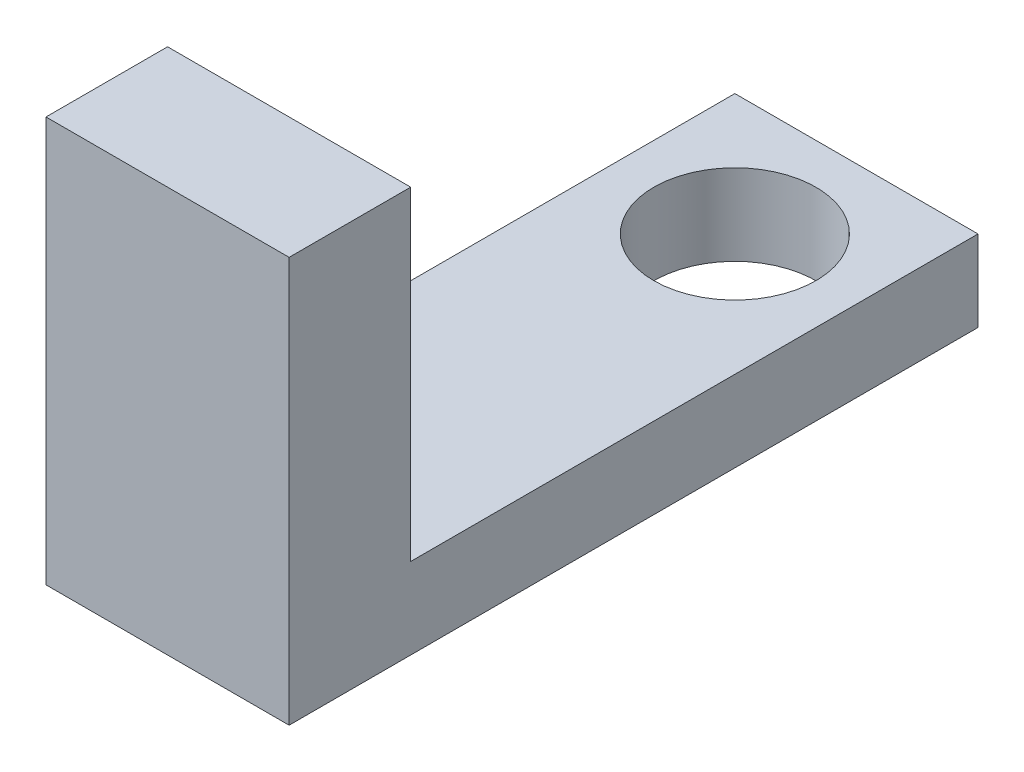
ISO-10303-21;
HEADER;
FILE_DESCRIPTION(('STEP AP214'),'2;1');
FILE_NAME('part.step','',(''),(''),'','','');
FILE_SCHEMA(('AUTOMOTIVE_DESIGN { 1 0 10303 214 1 1 1 1 }'));
ENDSEC;
DATA;
#1=APPLICATION_CONTEXT('core data for automotive mechanical design processes');
#2=APPLICATION_PROTOCOL_DEFINITION('international standard','automotive_design',2000,#1);
#3=PRODUCT_CONTEXT('',#1,'mechanical');
#4=PRODUCT('Part','Part','',(#3));
#5=PRODUCT_RELATED_PRODUCT_CATEGORY('part','',(#4));
#6=PRODUCT_DEFINITION_FORMATION('','',#4);
#7=PRODUCT_DEFINITION_CONTEXT('part definition',#1,'design');
#8=PRODUCT_DEFINITION('design','',#6,#7);
#9=PRODUCT_DEFINITION_SHAPE('','',#8);
#10=(LENGTH_UNIT() NAMED_UNIT(*) SI_UNIT(.MILLI.,.METRE.));
#11=(NAMED_UNIT(*) PLANE_ANGLE_UNIT() SI_UNIT($,.RADIAN.));
#12=(NAMED_UNIT(*) SI_UNIT($,.STERADIAN.) SOLID_ANGLE_UNIT());
#13=UNCERTAINTY_MEASURE_WITH_UNIT(LENGTH_MEASURE(1.E-05),#10,'distance_accuracy_value','');
#14=(GEOMETRIC_REPRESENTATION_CONTEXT(3) GLOBAL_UNCERTAINTY_ASSIGNED_CONTEXT((#13)) GLOBAL_UNIT_ASSIGNED_CONTEXT((#10,
#11,#12)) REPRESENTATION_CONTEXT('',''));
#15=CARTESIAN_POINT('',(0.,0.,0.));
#16=DIRECTION('',(0.,0.,1.));
#17=DIRECTION('',(1.,0.,0.));
#18=AXIS2_PLACEMENT_3D('',#15,#16,#17);
#19=CARTESIAN_POINT('',(30.,0.,0.));
#20=DIRECTION('',(0.,-1.,0.));
#21=DIRECTION('',(0.,0.,-1.));
#22=AXIS2_PLACEMENT_3D('',#19,#20,#21);
#23=PLANE('',#22);
#24=CARTESIAN_POINT('',(15.,0.,-55.));
#25=DIRECTION('',(0.,1.,0.));
#26=DIRECTION('',(0.,0.,1.));
#27=AXIS2_PLACEMENT_3D('',#24,#25,#26);
#28=CIRCLE('',#27,10.);
#29=CARTESIAN_POINT('',(15.,0.,-45.));
#30=VERTEX_POINT('',#29);
#31=EDGE_CURVE('E182',#30,#30,#28,.T.);
#32=ORIENTED_EDGE('',*,*,#31,.F.);
#33=EDGE_LOOP('',(#32));
#34=FACE_BOUND('',#33,.T.);
#35=DIRECTION('',(0.,0.,1.));
#36=VECTOR('',#35,1.);
#37=CARTESIAN_POINT('',(0.,0.,0.));
#38=LINE('',#37,#36);
#39=CARTESIAN_POINT('',(0.,0.,-70.));
#40=VERTEX_POINT('',#39);
#41=CARTESIAN_POINT('',(0.,0.,0.));
#42=VERTEX_POINT('',#41);
#43=EDGE_CURVE('E127',#40,#42,#38,.T.);
#44=ORIENTED_EDGE('',*,*,#43,.T.);
#45=DIRECTION('',(-1.,0.,0.));
#46=VECTOR('',#45,1.);
#47=CARTESIAN_POINT('',(30.,0.,0.));
#48=LINE('',#47,#46);
#49=CARTESIAN_POINT('',(30.,0.,0.));
#50=VERTEX_POINT('',#49);
#51=EDGE_CURVE('E11',#50,#42,#48,.T.);
#52=ORIENTED_EDGE('',*,*,#51,.F.);
#53=DIRECTION('',(0.,0.,1.));
#54=VECTOR('',#53,1.);
#55=CARTESIAN_POINT('',(30.,0.,0.));
#56=LINE('',#55,#54);
#57=CARTESIAN_POINT('',(30.,0.,-70.));
#58=VERTEX_POINT('',#57);
#59=EDGE_CURVE('E144',#58,#50,#56,.T.);
#60=ORIENTED_EDGE('',*,*,#59,.F.);
#61=DIRECTION('',(-1.,0.,0.));
#62=VECTOR('',#61,1.);
#63=CARTESIAN_POINT('',(30.,0.,-70.));
#64=LINE('',#63,#62);
#65=EDGE_CURVE('E123',#58,#40,#64,.T.);
#66=ORIENTED_EDGE('',*,*,#65,.T.);
#67=EDGE_LOOP('',(#44,#52,#60,#66));
#68=FACE_BOUND('',#67,.T.);
#69=ADVANCED_FACE('F38',(#34,#68),#23,.F.);
#70=CARTESIAN_POINT('',(30.,40.,0.));
#71=DIRECTION('',(0.,0.,1.));
#72=DIRECTION('',(0.,-1.,0.));
#73=AXIS2_PLACEMENT_3D('',#70,#71,#72);
#74=PLANE('',#73);
#75=DIRECTION('',(0.,1.,0.));
#76=VECTOR('',#75,1.);
#77=CARTESIAN_POINT('',(0.,40.,0.));
#78=LINE('',#77,#76);
#79=CARTESIAN_POINT('',(0.,40.,0.));
#80=VERTEX_POINT('',#79);
#81=EDGE_CURVE('E131',#42,#80,#78,.T.);
#82=ORIENTED_EDGE('',*,*,#81,.T.);
#83=DIRECTION('',(-1.,0.,0.));
#84=VECTOR('',#83,1.);
#85=CARTESIAN_POINT('',(30.,40.,0.));
#86=LINE('',#85,#84);
#87=CARTESIAN_POINT('',(30.,40.,0.));
#88=VERTEX_POINT('',#87);
#89=EDGE_CURVE('E47',#88,#80,#86,.T.);
#90=ORIENTED_EDGE('',*,*,#89,.F.);
#91=DIRECTION('',(0.,1.,0.));
#92=VECTOR('',#91,1.);
#93=CARTESIAN_POINT('',(30.,40.,0.));
#94=LINE('',#93,#92);
#95=EDGE_CURVE('E92',#50,#88,#94,.T.);
#96=ORIENTED_EDGE('',*,*,#95,.F.);
#97=ORIENTED_EDGE('',*,*,#51,.T.);
#98=EDGE_LOOP('',(#82,#90,#96,#97));
#99=FACE_BOUND('',#98,.T.);
#100=ADVANCED_FACE('F174',(#99),#74,.F.);
#101=CARTESIAN_POINT('',(30.,40.,15.));
#102=DIRECTION('',(0.,-1.,0.));
#103=DIRECTION('',(0.,0.,-1.));
#104=AXIS2_PLACEMENT_3D('',#101,#102,#103);
#105=PLANE('',#104);
#106=DIRECTION('',(0.,0.,1.));
#107=VECTOR('',#106,1.);
#108=CARTESIAN_POINT('',(0.,40.,15.));
#109=LINE('',#108,#107);
#110=CARTESIAN_POINT('',(0.,40.,15.));
#111=VERTEX_POINT('',#110);
#112=EDGE_CURVE('E135',#80,#111,#109,.T.);
#113=ORIENTED_EDGE('',*,*,#112,.T.);
#114=DIRECTION('',(-1.,0.,0.));
#115=VECTOR('',#114,1.);
#116=CARTESIAN_POINT('',(30.,40.,15.));
#117=LINE('',#116,#115);
#118=CARTESIAN_POINT('',(30.,40.,15.));
#119=VERTEX_POINT('',#118);
#120=EDGE_CURVE('E116',#119,#111,#117,.T.);
#121=ORIENTED_EDGE('',*,*,#120,.F.);
#122=DIRECTION('',(0.,0.,1.));
#123=VECTOR('',#122,1.);
#124=CARTESIAN_POINT('',(30.,40.,15.));
#125=LINE('',#124,#123);
#126=EDGE_CURVE('E105',#88,#119,#125,.T.);
#127=ORIENTED_EDGE('',*,*,#126,.F.);
#128=ORIENTED_EDGE('',*,*,#89,.T.);
#129=EDGE_LOOP('',(#113,#121,#127,#128));
#130=FACE_BOUND('',#129,.T.);
#131=ADVANCED_FACE('F154',(#130),#105,.F.);
#132=CARTESIAN_POINT('',(30.,-10.,15.));
#133=DIRECTION('',(0.,0.,-1.));
#134=DIRECTION('',(-1.,0.,0.));
#135=AXIS2_PLACEMENT_3D('',#132,#133,#134);
#136=PLANE('',#135);
#137=DIRECTION('',(0.,-1.,0.));
#138=VECTOR('',#137,1.);
#139=CARTESIAN_POINT('',(0.,-10.,15.));
#140=LINE('',#139,#138);
#141=CARTESIAN_POINT('',(0.,-10.,15.));
#142=VERTEX_POINT('',#141);
#143=EDGE_CURVE('E114',#111,#142,#140,.T.);
#144=ORIENTED_EDGE('',*,*,#143,.T.);
#145=DIRECTION('',(-1.,0.,0.));
#146=VECTOR('',#145,1.);
#147=CARTESIAN_POINT('',(30.,-10.,15.));
#148=LINE('',#147,#146);
#149=CARTESIAN_POINT('',(30.,-10.,15.));
#150=VERTEX_POINT('',#149);
#151=EDGE_CURVE('E111',#150,#142,#148,.T.);
#152=ORIENTED_EDGE('',*,*,#151,.F.);
#153=DIRECTION('',(0.,-1.,0.));
#154=VECTOR('',#153,1.);
#155=CARTESIAN_POINT('',(30.,-10.,15.));
#156=LINE('',#155,#154);
#157=EDGE_CURVE('E99',#119,#150,#156,.T.);
#158=ORIENTED_EDGE('',*,*,#157,.F.);
#159=ORIENTED_EDGE('',*,*,#120,.T.);
#160=EDGE_LOOP('',(#144,#152,#158,#159));
#161=FACE_BOUND('',#160,.T.);
#162=ADVANCED_FACE('F112',(#161),#136,.F.);
#163=CARTESIAN_POINT('',(30.,-10.,-70.));
#164=DIRECTION('',(0.,1.,0.));
#165=DIRECTION('',(0.,0.,1.));
#166=AXIS2_PLACEMENT_3D('',#163,#164,#165);
#167=PLANE('',#166);
#168=CARTESIAN_POINT('',(15.,-10.,-55.));
#169=DIRECTION('',(0.,1.,0.));
#170=DIRECTION('',(0.,0.,1.));
#171=AXIS2_PLACEMENT_3D('',#168,#169,#170);
#172=CIRCLE('',#171,10.);
#173=CARTESIAN_POINT('',(15.,-10.,-45.));
#174=VERTEX_POINT('',#173);
#175=EDGE_CURVE('E132',#174,#174,#172,.T.);
#176=ORIENTED_EDGE('',*,*,#175,.T.);
#177=EDGE_LOOP('',(#176));
#178=FACE_BOUND('',#177,.T.);
#179=DIRECTION('',(0.,0.,-1.));
#180=VECTOR('',#179,1.);
#181=CARTESIAN_POINT('',(0.,-10.,-70.));
#182=LINE('',#181,#180);
#183=CARTESIAN_POINT('',(0.,-10.,-70.));
#184=VERTEX_POINT('',#183);
#185=EDGE_CURVE('E78',#142,#184,#182,.T.);
#186=ORIENTED_EDGE('',*,*,#185,.T.);
#187=DIRECTION('',(-1.,0.,0.));
#188=VECTOR('',#187,1.);
#189=CARTESIAN_POINT('',(30.,-10.,-70.));
#190=LINE('',#189,#188);
#191=CARTESIAN_POINT('',(30.,-10.,-70.));
#192=VERTEX_POINT('',#191);
#193=EDGE_CURVE('E117',#192,#184,#190,.T.);
#194=ORIENTED_EDGE('',*,*,#193,.F.);
#195=DIRECTION('',(0.,0.,-1.));
#196=VECTOR('',#195,1.);
#197=CARTESIAN_POINT('',(30.,-10.,-70.));
#198=LINE('',#197,#196);
#199=EDGE_CURVE('E103',#150,#192,#198,.T.);
#200=ORIENTED_EDGE('',*,*,#199,.F.);
#201=ORIENTED_EDGE('',*,*,#151,.T.);
#202=EDGE_LOOP('',(#186,#194,#200,#201));
#203=FACE_BOUND('',#202,.T.);
#204=ADVANCED_FACE('F119',(#178,#203),#167,.F.);
#205=CARTESIAN_POINT('',(30.,0.,-70.));
#206=DIRECTION('',(0.,0.,1.));
#207=DIRECTION('',(1.,0.,0.));
#208=AXIS2_PLACEMENT_3D('',#205,#206,#207);
#209=PLANE('',#208);
#210=DIRECTION('',(0.,1.,0.));
#211=VECTOR('',#210,1.);
#212=CARTESIAN_POINT('',(0.,0.,-70.));
#213=LINE('',#212,#211);
#214=EDGE_CURVE('E84',#184,#40,#213,.T.);
#215=ORIENTED_EDGE('',*,*,#214,.T.);
#216=ORIENTED_EDGE('',*,*,#65,.F.);
#217=DIRECTION('',(0.,1.,0.));
#218=VECTOR('',#217,1.);
#219=CARTESIAN_POINT('',(30.,0.,-70.));
#220=LINE('',#219,#218);
#221=EDGE_CURVE('E55',#192,#58,#220,.T.);
#222=ORIENTED_EDGE('',*,*,#221,.F.);
#223=ORIENTED_EDGE('',*,*,#193,.T.);
#224=EDGE_LOOP('',(#215,#216,#222,#223));
#225=FACE_BOUND('',#224,.T.);
#226=ADVANCED_FACE('F161',(#225),#209,.F.);
#227=CARTESIAN_POINT('',(30.,0.,0.));
#228=DIRECTION('',(-1.,0.,0.));
#229=DIRECTION('',(0.,0.,1.));
#230=AXIS2_PLACEMENT_3D('',#227,#228,#229);
#231=PLANE('',#230);
#232=ORIENTED_EDGE('',*,*,#59,.T.);
#233=ORIENTED_EDGE('',*,*,#95,.T.);
#234=ORIENTED_EDGE('',*,*,#126,.T.);
#235=ORIENTED_EDGE('',*,*,#157,.T.);
#236=ORIENTED_EDGE('',*,*,#199,.T.);
#237=ORIENTED_EDGE('',*,*,#221,.T.);
#238=EDGE_LOOP('',(#232,#233,#234,#235,#236,#237));
#239=FACE_BOUND('',#238,.T.);
#240=ADVANCED_FACE('F101',(#239),#231,.F.);
#241=CARTESIAN_POINT('',(0.,0.,0.));
#242=DIRECTION('',(-1.,0.,0.));
#243=DIRECTION('',(0.,0.,1.));
#244=AXIS2_PLACEMENT_3D('',#241,#242,#243);
#245=PLANE('',#244);
#246=ORIENTED_EDGE('',*,*,#43,.F.);
#247=ORIENTED_EDGE('',*,*,#214,.F.);
#248=ORIENTED_EDGE('',*,*,#185,.F.);
#249=ORIENTED_EDGE('',*,*,#143,.F.);
#250=ORIENTED_EDGE('',*,*,#112,.F.);
#251=ORIENTED_EDGE('',*,*,#81,.F.);
#252=EDGE_LOOP('',(#246,#247,#248,#249,#250,#251));
#253=FACE_BOUND('',#252,.T.);
#254=ADVANCED_FACE('F157',(#253),#245,.T.);
#255=CARTESIAN_POINT('',(15.,-10.,-55.));
#256=DIRECTION('',(0.,1.,0.));
#257=DIRECTION('',(0.,0.,1.));
#258=AXIS2_PLACEMENT_3D('',#255,#256,#257);
#259=CYLINDRICAL_SURFACE('',#258,10.);
#260=ORIENTED_EDGE('',*,*,#175,.F.);
#261=EDGE_LOOP('',(#260));
#262=FACE_BOUND('',#261,.T.);
#263=ORIENTED_EDGE('',*,*,#31,.T.);
#264=EDGE_LOOP('',(#263));
#265=FACE_BOUND('',#264,.T.);
#266=ADVANCED_FACE('F196',(#262,#265),#259,.F.);
#267=CLOSED_SHELL('',(#69,#100,#131,#162,#204,#226,#240,#254,#266));
#268=MANIFOLD_SOLID_BREP('B2',#267);
#269=ADVANCED_BREP_SHAPE_REPRESENTATION('',(#18,#268),#14);
#270=SHAPE_DEFINITION_REPRESENTATION(#9,#269);
ENDSEC;
END-ISO-10303-21;
